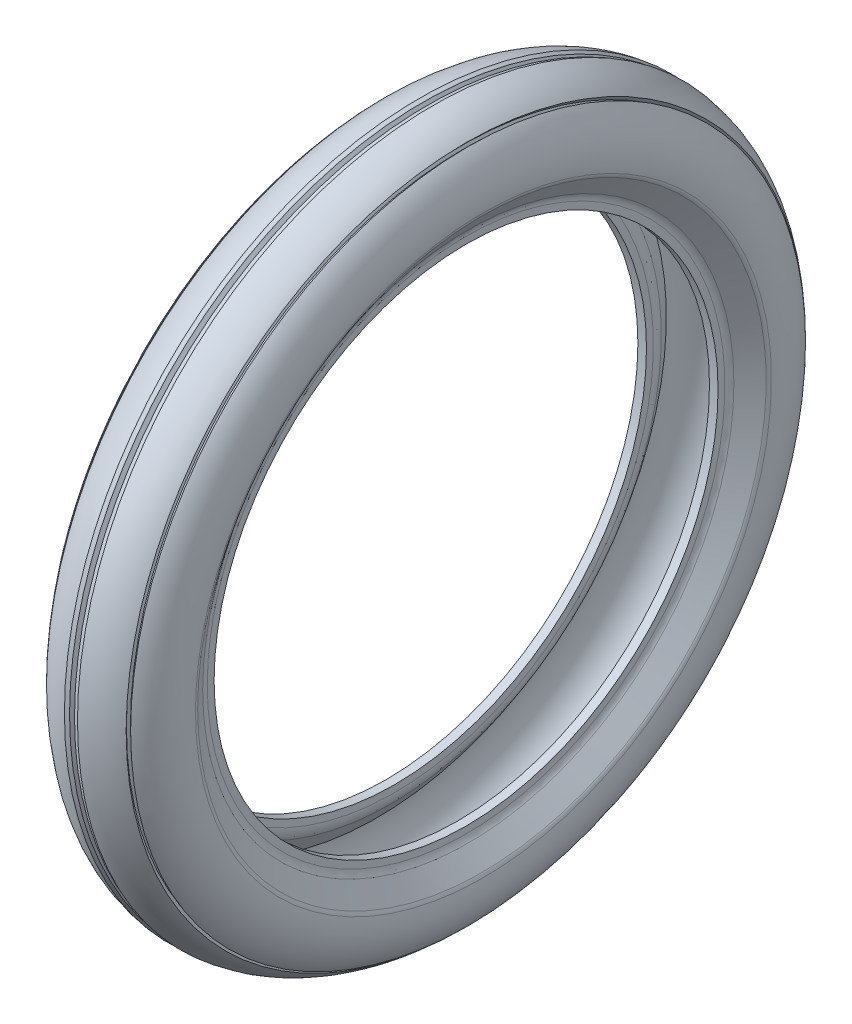
ISO-10303-21;
HEADER;
FILE_DESCRIPTION(('STEP AP214'),'2;1');
FILE_NAME('part.step','',(''),(''),'','','');
FILE_SCHEMA(('AUTOMOTIVE_DESIGN { 1 0 10303 214 1 1 1 1 }'));
ENDSEC;
DATA;
#1=APPLICATION_CONTEXT('core data for automotive mechanical design processes');
#2=APPLICATION_PROTOCOL_DEFINITION('international standard','automotive_design',2000,#1);
#3=PRODUCT_CONTEXT('',#1,'mechanical');
#4=PRODUCT('Part','Part','',(#3));
#5=PRODUCT_RELATED_PRODUCT_CATEGORY('part','',(#4));
#6=PRODUCT_DEFINITION_FORMATION('','',#4);
#7=PRODUCT_DEFINITION_CONTEXT('part definition',#1,'design');
#8=PRODUCT_DEFINITION('design','',#6,#7);
#9=PRODUCT_DEFINITION_SHAPE('','',#8);
#10=(LENGTH_UNIT() NAMED_UNIT(*) SI_UNIT(.MILLI.,.METRE.));
#11=(NAMED_UNIT(*) PLANE_ANGLE_UNIT() SI_UNIT($,.RADIAN.));
#12=(NAMED_UNIT(*) SI_UNIT($,.STERADIAN.) SOLID_ANGLE_UNIT());
#13=UNCERTAINTY_MEASURE_WITH_UNIT(LENGTH_MEASURE(1.E-05),#10,'distance_accuracy_value','');
#14=(GEOMETRIC_REPRESENTATION_CONTEXT(3) GLOBAL_UNCERTAINTY_ASSIGNED_CONTEXT((#13)) GLOBAL_UNIT_ASSIGNED_CONTEXT((#10,
#11,#12)) REPRESENTATION_CONTEXT('',''));
#15=CARTESIAN_POINT('',(0.,0.,0.));
#16=DIRECTION('',(0.,0.,1.));
#17=DIRECTION('',(1.,0.,0.));
#18=AXIS2_PLACEMENT_3D('',#15,#16,#17);
#19=CARTESIAN_POINT('',(-71.6083980696563,0.,0.));
#20=DIRECTION('',(-1.,0.,0.));
#21=DIRECTION('',(0.,0.,1.));
#22=AXIS2_PLACEMENT_3D('',#19,#20,#21);
#23=CYLINDRICAL_SURFACE('',#22,220.);
#24=CARTESIAN_POINT('',(-27.5,0.,0.));
#25=DIRECTION('',(-1.,0.,0.));
#26=DIRECTION('',(0.,0.,1.));
#27=AXIS2_PLACEMENT_3D('',#24,#25,#26);
#28=CIRCLE('',#27,220.);
#29=CARTESIAN_POINT('',(-27.5,0.,220.));
#30=VERTEX_POINT('',#29);
#31=EDGE_CURVE('E127',#30,#30,#28,.T.);
#32=ORIENTED_EDGE('',*,*,#31,.F.);
#33=EDGE_LOOP('',(#32));
#34=FACE_BOUND('',#33,.T.);
#35=CARTESIAN_POINT('',(-35.,0.,0.));
#36=DIRECTION('',(-1.,0.,0.));
#37=DIRECTION('',(0.,0.,1.));
#38=AXIS2_PLACEMENT_3D('',#35,#36,#37);
#39=CIRCLE('',#38,220.);
#40=CARTESIAN_POINT('',(-35.,0.,220.));
#41=VERTEX_POINT('',#40);
#42=EDGE_CURVE('E10',#41,#41,#39,.T.);
#43=ORIENTED_EDGE('',*,*,#42,.T.);
#44=EDGE_LOOP('',(#43));
#45=FACE_BOUND('',#44,.T.);
#46=ADVANCED_FACE('F30',(#34,#45),#23,.F.);
#47=CARTESIAN_POINT('',(-35.,220.,0.));
#48=DIRECTION('',(1.,0.,0.));
#49=DIRECTION('',(0.,0.,-1.));
#50=AXIS2_PLACEMENT_3D('',#47,#48,#49);
#51=PLANE('',#50);
#52=ORIENTED_EDGE('',*,*,#42,.F.);
#53=EDGE_LOOP('',(#52));
#54=FACE_BOUND('',#53,.T.);
#55=CARTESIAN_POINT('',(-35.,0.,0.));
#56=DIRECTION('',(-1.,0.,0.));
#57=DIRECTION('',(0.,0.,1.));
#58=AXIS2_PLACEMENT_3D('',#55,#56,#57);
#59=CIRCLE('',#58,226.);
#60=CARTESIAN_POINT('',(-35.,0.,226.));
#61=VERTEX_POINT('',#60);
#62=EDGE_CURVE('E36',#61,#61,#59,.T.);
#63=ORIENTED_EDGE('',*,*,#62,.T.);
#64=EDGE_LOOP('',(#63));
#65=FACE_BOUND('',#64,.T.);
#66=ADVANCED_FACE('F134',(#54,#65),#51,.F.);
#67=CARTESIAN_POINT('',(-45.,0.,0.));
#68=DIRECTION('',(-1.,0.,0.));
#69=DIRECTION('',(0.,0.,1.));
#70=AXIS2_PLACEMENT_3D('',#67,#68,#69);
#71=TOROIDAL_SURFACE('',#70,226.,10.);
#72=ORIENTED_EDGE('',*,*,#62,.F.);
#73=EDGE_LOOP('',(#72));
#74=FACE_BOUND('',#73,.T.);
#75=CARTESIAN_POINT('',(-36.9225541907911,0.,0.));
#76=DIRECTION('',(-1.,0.,0.));
#77=DIRECTION('',(0.,0.,1.));
#78=AXIS2_PLACEMENT_3D('',#75,#76,#77);
#79=CIRCLE('',#78,231.895326046903);
#80=CARTESIAN_POINT('',(-36.9225541907911,0.,231.895326046903));
#81=VERTEX_POINT('',#80);
#82=EDGE_CURVE('E40',#81,#81,#79,.T.);
#83=ORIENTED_EDGE('',*,*,#82,.T.);
#84=EDGE_LOOP('',(#83));
#85=FACE_BOUND('',#84,.T.);
#86=ADVANCED_FACE('F138',(#74,#85),#71,.F.);
#87=CARTESIAN_POINT('',(-48.821387112222,0.,0.));
#88=DIRECTION('',(-1.,0.,0.));
#89=DIRECTION('',(0.,0.,1.));
#90=AXIS2_PLACEMENT_3D('',#87,#88,#89);
#91=CONICAL_SURFACE('',#90,248.198440980839,0.940316250745592);
#92=ORIENTED_EDGE('',*,*,#82,.F.);
#93=EDGE_LOOP('',(#92));
#94=FACE_BOUND('',#93,.T.);
#95=CARTESIAN_POINT('',(-48.821387112222,0.,0.));
#96=DIRECTION('',(-1.,0.,0.));
#97=DIRECTION('',(0.,0.,1.));
#98=AXIS2_PLACEMENT_3D('',#95,#96,#97);
#99=CIRCLE('',#98,248.198440980839);
#100=CARTESIAN_POINT('',(-48.821387112222,0.,248.198440980839));
#101=VERTEX_POINT('',#100);
#102=EDGE_CURVE('E44',#101,#101,#99,.T.);
#103=ORIENTED_EDGE('',*,*,#102,.T.);
#104=EDGE_LOOP('',(#103));
#105=FACE_BOUND('',#104,.T.);
#106=ADVANCED_FACE('F143',(#94,#105),#91,.F.);
#107=CARTESIAN_POINT('',(-42.7633027553153,0.,0.));
#108=DIRECTION('',(-1.,0.,0.));
#109=DIRECTION('',(0.,0.,1.));
#110=AXIS2_PLACEMENT_3D('',#107,#108,#109);
#111=TOROIDAL_SURFACE('',#110,252.619935516017,7.50000000000001);
#112=ORIENTED_EDGE('',*,*,#102,.F.);
#113=EDGE_LOOP('',(#112));
#114=FACE_BOUND('',#113,.T.);
#115=CARTESIAN_POINT('',(-50.1679197980017,0.,0.));
#116=DIRECTION('',(-1.,0.,0.));
#117=DIRECTION('',(0.,0.,1.));
#118=AXIS2_PLACEMENT_3D('',#115,#116,#117);
#119=CIRCLE('',#118,251.427607351811);
#120=CARTESIAN_POINT('',(-50.1679197980017,0.,251.427607351811));
#121=VERTEX_POINT('',#120);
#122=EDGE_CURVE('E49',#121,#121,#119,.T.);
#123=ORIENTED_EDGE('',*,*,#122,.T.);
#124=EDGE_LOOP('',(#123));
#125=FACE_BOUND('',#124,.T.);
#126=ADVANCED_FACE('F149',(#114,#125),#111,.T.);
#127=CARTESIAN_POINT('',(0.,0.,0.));
#128=DIRECTION('',(-1.,0.,0.));
#129=DIRECTION('',(0.,0.,1.));
#130=AXIS2_PLACEMENT_3D('',#127,#128,#129);
#131=TOROIDAL_SURFACE('',#130,259.505894637965,50.8141604509645);
#132=ORIENTED_EDGE('',*,*,#122,.F.);
#133=EDGE_LOOP('',(#132));
#134=FACE_BOUND('',#133,.T.);
#135=CARTESIAN_POINT('',(-36.7306373715137,0.,0.));
#136=DIRECTION('',(-1.,0.,0.));
#137=DIRECTION('',(0.,0.,1.));
#138=AXIS2_PLACEMENT_3D('',#135,#136,#137);
#139=CIRCLE('',#138,294.619128334375);
#140=CARTESIAN_POINT('',(-36.7306373715137,0.,294.619128334375));
#141=VERTEX_POINT('',#140);
#142=EDGE_CURVE('E52',#141,#141,#139,.T.);
#143=ORIENTED_EDGE('',*,*,#142,.T.);
#144=EDGE_LOOP('',(#143));
#145=FACE_BOUND('',#144,.T.);
#146=ADVANCED_FACE('F153',(#134,#145),#131,.T.);
#147=CARTESIAN_POINT('',(-32.5279147987329,0.,0.));
#148=DIRECTION('',(-1.,0.,0.));
#149=DIRECTION('',(0.,0.,1.));
#150=AXIS2_PLACEMENT_3D('',#147,#148,#149);
#151=CONICAL_SURFACE('',#150,290.601469224172,0.76288920769044);
#152=ORIENTED_EDGE('',*,*,#142,.F.);
#153=EDGE_LOOP('',(#152));
#154=FACE_BOUND('',#153,.T.);
#155=CARTESIAN_POINT('',(-32.5279147987329,0.,0.));
#156=DIRECTION('',(-1.,0.,0.));
#157=DIRECTION('',(0.,0.,1.));
#158=AXIS2_PLACEMENT_3D('',#155,#156,#157);
#159=CIRCLE('',#158,290.601469224172);
#160=CARTESIAN_POINT('',(-32.5279147987329,0.,290.601469224172));
#161=VERTEX_POINT('',#160);
#162=EDGE_CURVE('E55',#161,#161,#159,.T.);
#163=ORIENTED_EDGE('',*,*,#162,.T.);
#164=EDGE_LOOP('',(#163));
#165=FACE_BOUND('',#164,.T.);
#166=ADVANCED_FACE('F157',(#154,#165),#151,.T.);
#167=CARTESIAN_POINT('',(-31.3368099275699,0.,0.));
#168=DIRECTION('',(1.,0.,0.));
#169=DIRECTION('',(0.,0.,-1.));
#170=AXIS2_PLACEMENT_3D('',#167,#168,#169);
#171=CONICAL_SURFACE('',#170,292.926620842126,1.09738115682822);
#172=ORIENTED_EDGE('',*,*,#162,.F.);
#173=EDGE_LOOP('',(#172));
#174=FACE_BOUND('',#173,.T.);
#175=CARTESIAN_POINT('',(-31.3368099275699,0.,0.));
#176=DIRECTION('',(-1.,0.,0.));
#177=DIRECTION('',(0.,0.,1.));
#178=AXIS2_PLACEMENT_3D('',#175,#176,#177);
#179=CIRCLE('',#178,292.926620842126);
#180=CARTESIAN_POINT('',(-31.3368099275699,0.,292.926620842126));
#181=VERTEX_POINT('',#180);
#182=EDGE_CURVE('E58',#181,#181,#179,.T.);
#183=ORIENTED_EDGE('',*,*,#182,.T.);
#184=EDGE_LOOP('',(#183));
#185=FACE_BOUND('',#184,.T.);
#186=ADVANCED_FACE('F161',(#174,#185),#171,.T.);
#187=CARTESIAN_POINT('',(-34.7713483394097,0.,0.));
#188=DIRECTION('',(-1.,0.,0.));
#189=DIRECTION('',(0.,0.,1.));
#190=AXIS2_PLACEMENT_3D('',#187,#188,#189);
#191=CONICAL_SURFACE('',#190,296.56034426275,0.813570904133701);
#192=ORIENTED_EDGE('',*,*,#182,.F.);
#193=EDGE_LOOP('',(#192));
#194=FACE_BOUND('',#193,.T.);
#195=CARTESIAN_POINT('',(-34.7713483394097,0.,0.));
#196=DIRECTION('',(-1.,0.,0.));
#197=DIRECTION('',(0.,0.,1.));
#198=AXIS2_PLACEMENT_3D('',#195,#196,#197);
#199=CIRCLE('',#198,296.56034426275);
#200=CARTESIAN_POINT('',(-34.7713483394097,0.,296.56034426275));
#201=VERTEX_POINT('',#200);
#202=EDGE_CURVE('E61',#201,#201,#199,.T.);
#203=ORIENTED_EDGE('',*,*,#202,.T.);
#204=EDGE_LOOP('',(#203));
#205=FACE_BOUND('',#204,.T.);
#206=ADVANCED_FACE('F165',(#194,#205),#191,.F.);
#207=CARTESIAN_POINT('',(0.,0.,0.));
#208=DIRECTION('',(-1.,0.,0.));
#209=DIRECTION('',(0.,0.,1.));
#210=AXIS2_PLACEMENT_3D('',#207,#208,#209);
#211=TOROIDAL_SURFACE('',#210,259.505894637965,50.8141604509645);
#212=ORIENTED_EDGE('',*,*,#202,.F.);
#213=EDGE_LOOP('',(#212));
#214=FACE_BOUND('',#213,.T.);
#215=CARTESIAN_POINT('',(-5.69422742995307,0.,0.));
#216=DIRECTION('',(-1.,0.,0.));
#217=DIRECTION('',(0.,0.,1.));
#218=AXIS2_PLACEMENT_3D('',#215,#216,#217);
#219=CIRCLE('',#218,310.);
#220=CARTESIAN_POINT('',(-5.69422742995307,0.,310.));
#221=VERTEX_POINT('',#220);
#222=EDGE_CURVE('E64',#221,#221,#219,.T.);
#223=ORIENTED_EDGE('',*,*,#222,.T.);
#224=EDGE_LOOP('',(#223));
#225=FACE_BOUND('',#224,.T.);
#226=ADVANCED_FACE('F169',(#214,#225),#211,.T.);
#227=CARTESIAN_POINT('',(-2.6760709973165,0.,0.));
#228=DIRECTION('',(-1.,0.,0.));
#229=DIRECTION('',(0.,0.,1.));
#230=AXIS2_PLACEMENT_3D('',#227,#228,#229);
#231=CONICAL_SURFACE('',#230,308.539216039435,0.450764866487037);
#232=ORIENTED_EDGE('',*,*,#222,.F.);
#233=EDGE_LOOP('',(#232));
#234=FACE_BOUND('',#233,.T.);
#235=CARTESIAN_POINT('',(-2.6760709973165,0.,0.));
#236=DIRECTION('',(-1.,0.,0.));
#237=DIRECTION('',(0.,0.,1.));
#238=AXIS2_PLACEMENT_3D('',#235,#236,#237);
#239=CIRCLE('',#238,308.539216039435);
#240=CARTESIAN_POINT('',(-2.6760709973165,0.,308.539216039435));
#241=VERTEX_POINT('',#240);
#242=EDGE_CURVE('E67',#241,#241,#239,.T.);
#243=ORIENTED_EDGE('',*,*,#242,.T.);
#244=EDGE_LOOP('',(#243));
#245=FACE_BOUND('',#244,.T.);
#246=ADVANCED_FACE('F173',(#234,#245),#231,.T.);
#247=CARTESIAN_POINT('',(0.,0.,0.));
#248=DIRECTION('',(-1.,0.,0.));
#249=DIRECTION('',(0.,0.,1.));
#250=AXIS2_PLACEMENT_3D('',#247,#248,#249);
#251=CONICAL_SURFACE('',#250,304.47050411113,0.989013550596471);
#252=ORIENTED_EDGE('',*,*,#242,.F.);
#253=EDGE_LOOP('',(#252));
#254=FACE_BOUND('',#253,.T.);
#255=CARTESIAN_POINT('',(0.,0.,0.));
#256=DIRECTION('',(-1.,0.,0.));
#257=DIRECTION('',(0.,0.,1.));
#258=AXIS2_PLACEMENT_3D('',#255,#256,#257);
#259=CIRCLE('',#258,304.47050411113);
#260=CARTESIAN_POINT('',(0.,0.,304.47050411113));
#261=VERTEX_POINT('',#260);
#262=EDGE_CURVE('E70',#261,#261,#259,.T.);
#263=ORIENTED_EDGE('',*,*,#262,.T.);
#264=EDGE_LOOP('',(#263));
#265=FACE_BOUND('',#264,.T.);
#266=ADVANCED_FACE('F177',(#254,#265),#251,.T.);
#267=CARTESIAN_POINT('',(1.66620649751081,0.,0.));
#268=DIRECTION('',(1.,0.,0.));
#269=DIRECTION('',(0.,0.,-1.));
#270=AXIS2_PLACEMENT_3D('',#267,#268,#269);
#271=CONICAL_SURFACE('',#270,308.539216039435,1.18211270102083);
#272=ORIENTED_EDGE('',*,*,#262,.F.);
#273=EDGE_LOOP('',(#272));
#274=FACE_BOUND('',#273,.T.);
#275=CARTESIAN_POINT('',(1.66620649751081,0.,0.));
#276=DIRECTION('',(-1.,0.,0.));
#277=DIRECTION('',(0.,0.,1.));
#278=AXIS2_PLACEMENT_3D('',#275,#276,#277);
#279=CIRCLE('',#278,308.539216039435);
#280=CARTESIAN_POINT('',(1.66620649751081,0.,308.539216039435));
#281=VERTEX_POINT('',#280);
#282=EDGE_CURVE('E73',#281,#281,#279,.T.);
#283=ORIENTED_EDGE('',*,*,#282,.T.);
#284=EDGE_LOOP('',(#283));
#285=FACE_BOUND('',#284,.T.);
#286=ADVANCED_FACE('F181',(#274,#285),#271,.T.);
#287=CARTESIAN_POINT('',(5.69422742995308,0.,0.));
#288=DIRECTION('',(1.,0.,0.));
#289=DIRECTION('',(0.,0.,-1.));
#290=AXIS2_PLACEMENT_3D('',#287,#288,#289);
#291=CONICAL_SURFACE('',#290,310.,0.347904423946012);
#292=ORIENTED_EDGE('',*,*,#282,.F.);
#293=EDGE_LOOP('',(#292));
#294=FACE_BOUND('',#293,.T.);
#295=CARTESIAN_POINT('',(5.69422742995308,0.,0.));
#296=DIRECTION('',(-1.,0.,0.));
#297=DIRECTION('',(0.,0.,1.));
#298=AXIS2_PLACEMENT_3D('',#295,#296,#297);
#299=CIRCLE('',#298,310.);
#300=CARTESIAN_POINT('',(5.69422742995308,0.,310.));
#301=VERTEX_POINT('',#300);
#302=EDGE_CURVE('E76',#301,#301,#299,.T.);
#303=ORIENTED_EDGE('',*,*,#302,.T.);
#304=EDGE_LOOP('',(#303));
#305=FACE_BOUND('',#304,.T.);
#306=ADVANCED_FACE('F185',(#294,#305),#291,.T.);
#307=CARTESIAN_POINT('',(0.,0.,0.));
#308=DIRECTION('',(-1.,0.,0.));
#309=DIRECTION('',(0.,0.,1.));
#310=AXIS2_PLACEMENT_3D('',#307,#308,#309);
#311=TOROIDAL_SURFACE('',#310,259.505894637965,50.8141604509645);
#312=ORIENTED_EDGE('',*,*,#302,.F.);
#313=EDGE_LOOP('',(#312));
#314=FACE_BOUND('',#313,.T.);
#315=CARTESIAN_POINT('',(34.7713483394098,0.,0.));
#316=DIRECTION('',(-1.,0.,0.));
#317=DIRECTION('',(0.,0.,1.));
#318=AXIS2_PLACEMENT_3D('',#315,#316,#317);
#319=CIRCLE('',#318,296.56034426275);
#320=CARTESIAN_POINT('',(34.7713483394098,0.,296.56034426275));
#321=VERTEX_POINT('',#320);
#322=EDGE_CURVE('E79',#321,#321,#319,.T.);
#323=ORIENTED_EDGE('',*,*,#322,.T.);
#324=EDGE_LOOP('',(#323));
#325=FACE_BOUND('',#324,.T.);
#326=ADVANCED_FACE('F189',(#314,#325),#311,.T.);
#327=CARTESIAN_POINT('',(31.3368099275699,0.,0.));
#328=DIRECTION('',(1.,0.,0.));
#329=DIRECTION('',(0.,0.,-1.));
#330=AXIS2_PLACEMENT_3D('',#327,#328,#329);
#331=CONICAL_SURFACE('',#330,292.926620842126,0.8135709041337);
#332=ORIENTED_EDGE('',*,*,#322,.F.);
#333=EDGE_LOOP('',(#332));
#334=FACE_BOUND('',#333,.T.);
#335=CARTESIAN_POINT('',(31.3368099275699,0.,0.));
#336=DIRECTION('',(-1.,0.,0.));
#337=DIRECTION('',(0.,0.,1.));
#338=AXIS2_PLACEMENT_3D('',#335,#336,#337);
#339=CIRCLE('',#338,292.926620842126);
#340=CARTESIAN_POINT('',(31.3368099275699,0.,292.926620842126));
#341=VERTEX_POINT('',#340);
#342=EDGE_CURVE('E82',#341,#341,#339,.T.);
#343=ORIENTED_EDGE('',*,*,#342,.T.);
#344=EDGE_LOOP('',(#343));
#345=FACE_BOUND('',#344,.T.);
#346=ADVANCED_FACE('F193',(#334,#345),#331,.F.);
#347=CARTESIAN_POINT('',(32.5279147987329,0.,0.));
#348=DIRECTION('',(-1.,0.,0.));
#349=DIRECTION('',(0.,0.,1.));
#350=AXIS2_PLACEMENT_3D('',#347,#348,#349);
#351=CONICAL_SURFACE('',#350,290.601469224172,1.09738115682822);
#352=ORIENTED_EDGE('',*,*,#342,.F.);
#353=EDGE_LOOP('',(#352));
#354=FACE_BOUND('',#353,.T.);
#355=CARTESIAN_POINT('',(32.5279147987329,0.,0.));
#356=DIRECTION('',(-1.,0.,0.));
#357=DIRECTION('',(0.,0.,1.));
#358=AXIS2_PLACEMENT_3D('',#355,#356,#357);
#359=CIRCLE('',#358,290.601469224172);
#360=CARTESIAN_POINT('',(32.5279147987329,0.,290.601469224172));
#361=VERTEX_POINT('',#360);
#362=EDGE_CURVE('E85',#361,#361,#359,.T.);
#363=ORIENTED_EDGE('',*,*,#362,.T.);
#364=EDGE_LOOP('',(#363));
#365=FACE_BOUND('',#364,.T.);
#366=ADVANCED_FACE('F197',(#354,#365),#351,.T.);
#367=CARTESIAN_POINT('',(36.7306373715137,0.,0.));
#368=DIRECTION('',(1.,0.,0.));
#369=DIRECTION('',(0.,0.,-1.));
#370=AXIS2_PLACEMENT_3D('',#367,#368,#369);
#371=CONICAL_SURFACE('',#370,294.619128334375,0.762889207690441);
#372=ORIENTED_EDGE('',*,*,#362,.F.);
#373=EDGE_LOOP('',(#372));
#374=FACE_BOUND('',#373,.T.);
#375=CARTESIAN_POINT('',(36.7306373715137,0.,0.));
#376=DIRECTION('',(-1.,0.,0.));
#377=DIRECTION('',(0.,0.,1.));
#378=AXIS2_PLACEMENT_3D('',#375,#376,#377);
#379=CIRCLE('',#378,294.619128334375);
#380=CARTESIAN_POINT('',(36.7306373715137,0.,294.619128334375));
#381=VERTEX_POINT('',#380);
#382=EDGE_CURVE('E88',#381,#381,#379,.T.);
#383=ORIENTED_EDGE('',*,*,#382,.T.);
#384=EDGE_LOOP('',(#383));
#385=FACE_BOUND('',#384,.T.);
#386=ADVANCED_FACE('F201',(#374,#385),#371,.T.);
#387=CARTESIAN_POINT('',(0.,0.,0.));
#388=DIRECTION('',(-1.,0.,0.));
#389=DIRECTION('',(0.,0.,1.));
#390=AXIS2_PLACEMENT_3D('',#387,#388,#389);
#391=TOROIDAL_SURFACE('',#390,259.505894637965,50.8141604509645);
#392=ORIENTED_EDGE('',*,*,#382,.F.);
#393=EDGE_LOOP('',(#392));
#394=FACE_BOUND('',#393,.T.);
#395=CARTESIAN_POINT('',(50.1679197980017,0.,0.));
#396=DIRECTION('',(-1.,0.,0.));
#397=DIRECTION('',(0.,0.,1.));
#398=AXIS2_PLACEMENT_3D('',#395,#396,#397);
#399=CIRCLE('',#398,251.427607351811);
#400=CARTESIAN_POINT('',(50.1679197980017,0.,251.427607351811));
#401=VERTEX_POINT('',#400);
#402=EDGE_CURVE('E91',#401,#401,#399,.T.);
#403=ORIENTED_EDGE('',*,*,#402,.T.);
#404=EDGE_LOOP('',(#403));
#405=FACE_BOUND('',#404,.T.);
#406=ADVANCED_FACE('F205',(#394,#405),#391,.T.);
#407=CARTESIAN_POINT('',(42.7633027553153,0.,0.));
#408=DIRECTION('',(-1.,0.,0.));
#409=DIRECTION('',(0.,0.,1.));
#410=AXIS2_PLACEMENT_3D('',#407,#408,#409);
#411=TOROIDAL_SURFACE('',#410,252.619935516017,7.50000000000001);
#412=ORIENTED_EDGE('',*,*,#402,.F.);
#413=EDGE_LOOP('',(#412));
#414=FACE_BOUND('',#413,.T.);
#415=CARTESIAN_POINT('',(48.821387112222,0.,0.));
#416=DIRECTION('',(-1.,0.,0.));
#417=DIRECTION('',(0.,0.,1.));
#418=AXIS2_PLACEMENT_3D('',#415,#416,#417);
#419=CIRCLE('',#418,248.198440980839);
#420=CARTESIAN_POINT('',(48.821387112222,0.,248.198440980839));
#421=VERTEX_POINT('',#420);
#422=EDGE_CURVE('E94',#421,#421,#419,.T.);
#423=ORIENTED_EDGE('',*,*,#422,.T.);
#424=EDGE_LOOP('',(#423));
#425=FACE_BOUND('',#424,.T.);
#426=ADVANCED_FACE('F209',(#414,#425),#411,.T.);
#427=CARTESIAN_POINT('',(36.9225541907911,0.,0.));
#428=DIRECTION('',(1.,0.,0.));
#429=DIRECTION('',(0.,0.,-1.));
#430=AXIS2_PLACEMENT_3D('',#427,#428,#429);
#431=CONICAL_SURFACE('',#430,231.895326046903,0.940316250745591);
#432=ORIENTED_EDGE('',*,*,#422,.F.);
#433=EDGE_LOOP('',(#432));
#434=FACE_BOUND('',#433,.T.);
#435=CARTESIAN_POINT('',(36.9225541907911,0.,0.));
#436=DIRECTION('',(-1.,0.,0.));
#437=DIRECTION('',(0.,0.,1.));
#438=AXIS2_PLACEMENT_3D('',#435,#436,#437);
#439=CIRCLE('',#438,231.895326046903);
#440=CARTESIAN_POINT('',(36.9225541907911,0.,231.895326046903));
#441=VERTEX_POINT('',#440);
#442=EDGE_CURVE('E97',#441,#441,#439,.T.);
#443=ORIENTED_EDGE('',*,*,#442,.T.);
#444=EDGE_LOOP('',(#443));
#445=FACE_BOUND('',#444,.T.);
#446=ADVANCED_FACE('F213',(#434,#445),#431,.F.);
#447=CARTESIAN_POINT('',(45.,0.,0.));
#448=DIRECTION('',(-1.,0.,0.));
#449=DIRECTION('',(0.,0.,1.));
#450=AXIS2_PLACEMENT_3D('',#447,#448,#449);
#451=TOROIDAL_SURFACE('',#450,226.,10.);
#452=ORIENTED_EDGE('',*,*,#442,.F.);
#453=EDGE_LOOP('',(#452));
#454=FACE_BOUND('',#453,.T.);
#455=CARTESIAN_POINT('',(35.,0.,0.));
#456=DIRECTION('',(-1.,0.,0.));
#457=DIRECTION('',(0.,0.,1.));
#458=AXIS2_PLACEMENT_3D('',#455,#456,#457);
#459=CIRCLE('',#458,226.);
#460=CARTESIAN_POINT('',(35.,0.,226.));
#461=VERTEX_POINT('',#460);
#462=EDGE_CURVE('E100',#461,#461,#459,.T.);
#463=ORIENTED_EDGE('',*,*,#462,.T.);
#464=EDGE_LOOP('',(#463));
#465=FACE_BOUND('',#464,.T.);
#466=ADVANCED_FACE('F217',(#454,#465),#451,.F.);
#467=CARTESIAN_POINT('',(35.,220.,0.));
#468=DIRECTION('',(-1.,0.,0.));
#469=DIRECTION('',(0.,0.,1.));
#470=AXIS2_PLACEMENT_3D('',#467,#468,#469);
#471=PLANE('',#470);
#472=ORIENTED_EDGE('',*,*,#462,.F.);
#473=EDGE_LOOP('',(#472));
#474=FACE_BOUND('',#473,.T.);
#475=CARTESIAN_POINT('',(35.,0.,0.));
#476=DIRECTION('',(-1.,0.,0.));
#477=DIRECTION('',(0.,0.,1.));
#478=AXIS2_PLACEMENT_3D('',#475,#476,#477);
#479=CIRCLE('',#478,220.);
#480=CARTESIAN_POINT('',(35.,0.,220.));
#481=VERTEX_POINT('',#480);
#482=EDGE_CURVE('E103',#481,#481,#479,.T.);
#483=ORIENTED_EDGE('',*,*,#482,.T.);
#484=EDGE_LOOP('',(#483));
#485=FACE_BOUND('',#484,.T.);
#486=ADVANCED_FACE('F221',(#474,#485),#471,.F.);
#487=CARTESIAN_POINT('',(-71.6083980696563,0.,0.));
#488=DIRECTION('',(-1.,0.,0.));
#489=DIRECTION('',(0.,0.,1.));
#490=AXIS2_PLACEMENT_3D('',#487,#488,#489);
#491=CYLINDRICAL_SURFACE('',#490,220.);
#492=ORIENTED_EDGE('',*,*,#482,.F.);
#493=EDGE_LOOP('',(#492));
#494=FACE_BOUND('',#493,.T.);
#495=CARTESIAN_POINT('',(27.5,0.,0.));
#496=DIRECTION('',(-1.,0.,0.));
#497=DIRECTION('',(0.,0.,1.));
#498=AXIS2_PLACEMENT_3D('',#495,#496,#497);
#499=CIRCLE('',#498,220.);
#500=CARTESIAN_POINT('',(27.5,0.,220.));
#501=VERTEX_POINT('',#500);
#502=EDGE_CURVE('E106',#501,#501,#499,.T.);
#503=ORIENTED_EDGE('',*,*,#502,.T.);
#504=EDGE_LOOP('',(#503));
#505=FACE_BOUND('',#504,.T.);
#506=ADVANCED_FACE('F225',(#494,#505),#491,.F.);
#507=CARTESIAN_POINT('',(27.5,220.,0.));
#508=DIRECTION('',(1.,0.,0.));
#509=DIRECTION('',(0.,0.,-1.));
#510=AXIS2_PLACEMENT_3D('',#507,#508,#509);
#511=PLANE('',#510);
#512=ORIENTED_EDGE('',*,*,#502,.F.);
#513=EDGE_LOOP('',(#512));
#514=FACE_BOUND('',#513,.T.);
#515=CARTESIAN_POINT('',(27.5,0.,0.));
#516=DIRECTION('',(-1.,0.,0.));
#517=DIRECTION('',(0.,0.,1.));
#518=AXIS2_PLACEMENT_3D('',#515,#516,#517);
#519=CIRCLE('',#518,226.);
#520=CARTESIAN_POINT('',(27.5,0.,226.));
#521=VERTEX_POINT('',#520);
#522=EDGE_CURVE('E109',#521,#521,#519,.T.);
#523=ORIENTED_EDGE('',*,*,#522,.T.);
#524=EDGE_LOOP('',(#523));
#525=FACE_BOUND('',#524,.T.);
#526=ADVANCED_FACE('F229',(#514,#525),#511,.F.);
#527=CARTESIAN_POINT('',(45.,0.,0.));
#528=DIRECTION('',(-1.,0.,0.));
#529=DIRECTION('',(0.,0.,1.));
#530=AXIS2_PLACEMENT_3D('',#527,#528,#529);
#531=TOROIDAL_SURFACE('',#530,226.,17.5);
#532=ORIENTED_EDGE('',*,*,#522,.F.);
#533=EDGE_LOOP('',(#532));
#534=FACE_BOUND('',#533,.T.);
#535=CARTESIAN_POINT('',(30.8644698338844,0.,0.));
#536=DIRECTION('',(-1.,0.,0.));
#537=DIRECTION('',(0.,0.,1.));
#538=AXIS2_PLACEMENT_3D('',#535,#536,#537);
#539=CIRCLE('',#538,236.31682058208);
#540=CARTESIAN_POINT('',(30.8644698338844,0.,236.31682058208));
#541=VERTEX_POINT('',#540);
#542=EDGE_CURVE('E112',#541,#541,#539,.T.);
#543=ORIENTED_EDGE('',*,*,#542,.T.);
#544=EDGE_LOOP('',(#543));
#545=FACE_BOUND('',#544,.T.);
#546=ADVANCED_FACE('F233',(#534,#545),#531,.T.);
#547=CARTESIAN_POINT('',(42.7633027553153,0.,0.));
#548=DIRECTION('',(1.,0.,0.));
#549=DIRECTION('',(0.,0.,-1.));
#550=AXIS2_PLACEMENT_3D('',#547,#548,#549);
#551=CONICAL_SURFACE('',#550,252.619935516017,0.940316250745591);
#552=ORIENTED_EDGE('',*,*,#542,.F.);
#553=EDGE_LOOP('',(#552));
#554=FACE_BOUND('',#553,.T.);
#555=CARTESIAN_POINT('',(42.7633027553153,0.,0.));
#556=DIRECTION('',(-1.,0.,0.));
#557=DIRECTION('',(0.,0.,1.));
#558=AXIS2_PLACEMENT_3D('',#555,#556,#557);
#559=CIRCLE('',#558,252.619935516017);
#560=CARTESIAN_POINT('',(42.7633027553153,0.,252.619935516017));
#561=VERTEX_POINT('',#560);
#562=EDGE_CURVE('E115',#561,#561,#559,.T.);
#563=ORIENTED_EDGE('',*,*,#562,.T.);
#564=EDGE_LOOP('',(#563));
#565=FACE_BOUND('',#564,.T.);
#566=ADVANCED_FACE('F237',(#554,#565),#551,.T.);
#567=CARTESIAN_POINT('',(0.,0.,0.));
#568=DIRECTION('',(-1.,0.,0.));
#569=DIRECTION('',(0.,0.,1.));
#570=AXIS2_PLACEMENT_3D('',#567,#568,#569);
#571=TOROIDAL_SURFACE('',#570,259.505894637965,43.3141604509645);
#572=ORIENTED_EDGE('',*,*,#562,.F.);
#573=EDGE_LOOP('',(#572));
#574=FACE_BOUND('',#573,.T.);
#575=CARTESIAN_POINT('',(-42.7633027553153,0.,0.));
#576=DIRECTION('',(-1.,0.,0.));
#577=DIRECTION('',(0.,0.,1.));
#578=AXIS2_PLACEMENT_3D('',#575,#576,#577);
#579=CIRCLE('',#578,252.619935516017);
#580=CARTESIAN_POINT('',(-42.7633027553153,0.,252.619935516017));
#581=VERTEX_POINT('',#580);
#582=EDGE_CURVE('E118',#581,#581,#579,.T.);
#583=ORIENTED_EDGE('',*,*,#582,.T.);
#584=EDGE_LOOP('',(#583));
#585=FACE_BOUND('',#584,.T.);
#586=ADVANCED_FACE('F241',(#574,#585),#571,.F.);
#587=CARTESIAN_POINT('',(-30.8644698338844,0.,0.));
#588=DIRECTION('',(-1.,0.,0.));
#589=DIRECTION('',(0.,0.,1.));
#590=AXIS2_PLACEMENT_3D('',#587,#588,#589);
#591=CONICAL_SURFACE('',#590,236.31682058208,0.940316250745592);
#592=ORIENTED_EDGE('',*,*,#582,.F.);
#593=EDGE_LOOP('',(#592));
#594=FACE_BOUND('',#593,.T.);
#595=CARTESIAN_POINT('',(-30.8644698338844,0.,0.));
#596=DIRECTION('',(-1.,0.,0.));
#597=DIRECTION('',(0.,0.,1.));
#598=AXIS2_PLACEMENT_3D('',#595,#596,#597);
#599=CIRCLE('',#598,236.31682058208);
#600=CARTESIAN_POINT('',(-30.8644698338844,0.,236.31682058208));
#601=VERTEX_POINT('',#600);
#602=EDGE_CURVE('E121',#601,#601,#599,.T.);
#603=ORIENTED_EDGE('',*,*,#602,.T.);
#604=EDGE_LOOP('',(#603));
#605=FACE_BOUND('',#604,.T.);
#606=ADVANCED_FACE('F245',(#594,#605),#591,.T.);
#607=CARTESIAN_POINT('',(-45.,0.,0.));
#608=DIRECTION('',(-1.,0.,0.));
#609=DIRECTION('',(0.,0.,1.));
#610=AXIS2_PLACEMENT_3D('',#607,#608,#609);
#611=TOROIDAL_SURFACE('',#610,226.,17.5);
#612=ORIENTED_EDGE('',*,*,#602,.F.);
#613=EDGE_LOOP('',(#612));
#614=FACE_BOUND('',#613,.T.);
#615=CARTESIAN_POINT('',(-27.5,0.,0.));
#616=DIRECTION('',(-1.,0.,0.));
#617=DIRECTION('',(0.,0.,1.));
#618=AXIS2_PLACEMENT_3D('',#615,#616,#617);
#619=CIRCLE('',#618,226.);
#620=CARTESIAN_POINT('',(-27.5,0.,226.));
#621=VERTEX_POINT('',#620);
#622=EDGE_CURVE('E124',#621,#621,#619,.T.);
#623=ORIENTED_EDGE('',*,*,#622,.T.);
#624=EDGE_LOOP('',(#623));
#625=FACE_BOUND('',#624,.T.);
#626=ADVANCED_FACE('F249',(#614,#625),#611,.T.);
#627=CARTESIAN_POINT('',(-27.5,220.,0.));
#628=DIRECTION('',(-1.,0.,0.));
#629=DIRECTION('',(0.,0.,1.));
#630=AXIS2_PLACEMENT_3D('',#627,#628,#629);
#631=PLANE('',#630);
#632=ORIENTED_EDGE('',*,*,#622,.F.);
#633=EDGE_LOOP('',(#632));
#634=FACE_BOUND('',#633,.T.);
#635=ORIENTED_EDGE('',*,*,#31,.T.);
#636=EDGE_LOOP('',(#635));
#637=FACE_BOUND('',#636,.T.);
#638=ADVANCED_FACE('F131',(#634,#637),#631,.F.);
#639=CLOSED_SHELL('',(#46,#66,#86,#106,#126,#146,#166,#186,#206,#226,#246,#266,#286,#306,#326,
#346,#366,#386,#406,#426,#446,#466,#486,#506,#526,#546,#566,#586,#606,#626,#638));
#640=MANIFOLD_SOLID_BREP('B2',#639);
#641=ADVANCED_BREP_SHAPE_REPRESENTATION('',(#18,#640),#14);
#642=SHAPE_DEFINITION_REPRESENTATION(#9,#641);
ENDSEC;
END-ISO-10303-21;
